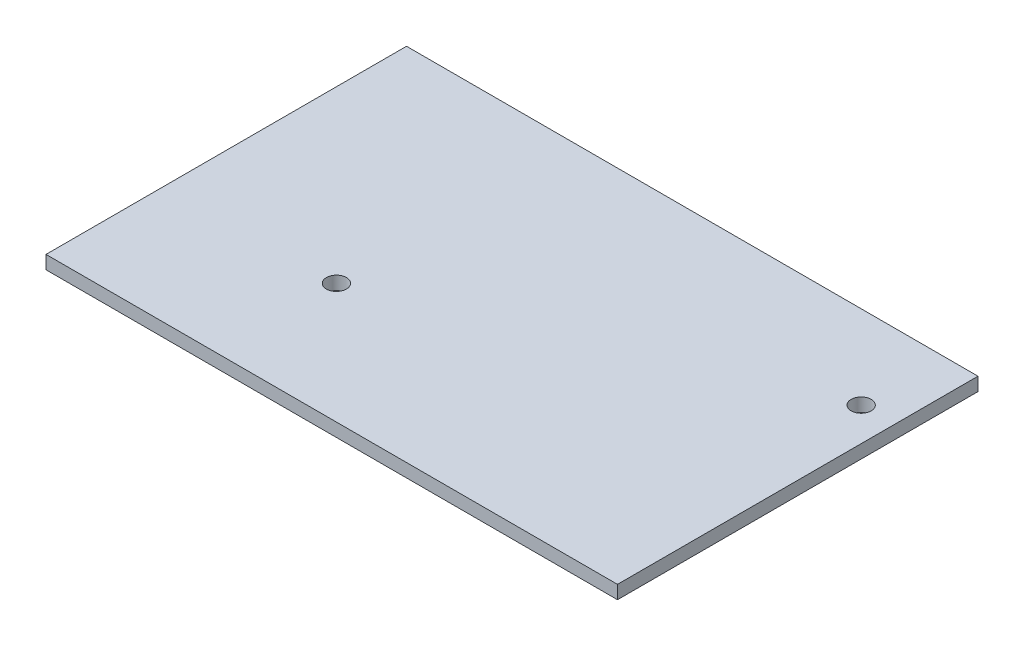
ISO-10303-21;
HEADER;
FILE_DESCRIPTION(('STEP AP214'),'2;1');
FILE_NAME('part.step','',(''),(''),'','','');
FILE_SCHEMA(('AUTOMOTIVE_DESIGN { 1 0 10303 214 1 1 1 1 }'));
ENDSEC;
DATA;
#1=APPLICATION_CONTEXT('core data for automotive mechanical design processes');
#2=APPLICATION_PROTOCOL_DEFINITION('international standard','automotive_design',2000,#1);
#3=PRODUCT_CONTEXT('',#1,'mechanical');
#4=PRODUCT('Part','Part','',(#3));
#5=PRODUCT_RELATED_PRODUCT_CATEGORY('part','',(#4));
#6=PRODUCT_DEFINITION_FORMATION('','',#4);
#7=PRODUCT_DEFINITION_CONTEXT('part definition',#1,'design');
#8=PRODUCT_DEFINITION('design','',#6,#7);
#9=PRODUCT_DEFINITION_SHAPE('','',#8);
#10=(LENGTH_UNIT() NAMED_UNIT(*) SI_UNIT(.MILLI.,.METRE.));
#11=(NAMED_UNIT(*) PLANE_ANGLE_UNIT() SI_UNIT($,.RADIAN.));
#12=(NAMED_UNIT(*) SI_UNIT($,.STERADIAN.) SOLID_ANGLE_UNIT());
#13=UNCERTAINTY_MEASURE_WITH_UNIT(LENGTH_MEASURE(1.E-05),#10,'distance_accuracy_value','');
#14=(GEOMETRIC_REPRESENTATION_CONTEXT(3) GLOBAL_UNCERTAINTY_ASSIGNED_CONTEXT((#13)) GLOBAL_UNIT_ASSIGNED_CONTEXT((#10,
#11,#12)) REPRESENTATION_CONTEXT('',''));
#15=CARTESIAN_POINT('',(0.,0.,0.));
#16=DIRECTION('',(0.,0.,1.));
#17=DIRECTION('',(1.,0.,0.));
#18=AXIS2_PLACEMENT_3D('',#15,#16,#17);
#19=CARTESIAN_POINT('',(0.,2.,0.));
#20=DIRECTION('',(0.,1.,0.));
#21=DIRECTION('',(0.,0.,1.));
#22=AXIS2_PLACEMENT_3D('',#19,#20,#21);
#23=PLANE('',#22);
#24=CARTESIAN_POINT('',(-110.688679245283,2.,-25.6415094339623));
#25=DIRECTION('',(0.,1.,0.));
#26=DIRECTION('',(0.,0.,1.));
#27=AXIS2_PLACEMENT_3D('',#24,#25,#26);
#28=CIRCLE('',#27,1.5);
#29=CARTESIAN_POINT('',(-110.688679245283,2.,-24.1415094339623));
#30=VERTEX_POINT('',#29);
#31=EDGE_CURVE('E112',#30,#30,#28,.T.);
#32=ORIENTED_EDGE('',*,*,#31,.F.);
#33=EDGE_LOOP('',(#32));
#34=FACE_BOUND('',#33,.T.);
#35=DIRECTION('',(0.,0.,1.));
#36=VECTOR('',#35,1.);
#37=CARTESIAN_POINT('',(-136.188679245283,2.,-61.6415094339623));
#38=LINE('',#37,#36);
#39=CARTESIAN_POINT('',(-136.188679245283,2.,-61.6415094339623));
#40=VERTEX_POINT('',#39);
#41=CARTESIAN_POINT('',(-136.188679245283,2.,-7.64150943396226));
#42=VERTEX_POINT('',#41);
#43=EDGE_CURVE('E92',#40,#42,#38,.T.);
#44=ORIENTED_EDGE('',*,*,#43,.T.);
#45=DIRECTION('',(1.,0.,0.));
#46=VECTOR('',#45,1.);
#47=CARTESIAN_POINT('',(-136.188679245283,2.,-7.64150943396226));
#48=LINE('',#47,#46);
#49=CARTESIAN_POINT('',(-50.588679245283,2.,-7.64150943396227));
#50=VERTEX_POINT('',#49);
#51=EDGE_CURVE('E87',#42,#50,#48,.T.);
#52=ORIENTED_EDGE('',*,*,#51,.T.);
#53=DIRECTION('',(0.,0.,-1.));
#54=VECTOR('',#53,1.);
#55=CARTESIAN_POINT('',(-50.588679245283,2.,-61.6415094339623));
#56=LINE('',#55,#54);
#57=CARTESIAN_POINT('',(-50.588679245283,2.,-61.6415094339623));
#58=VERTEX_POINT('',#57);
#59=EDGE_CURVE('E90',#50,#58,#56,.T.);
#60=ORIENTED_EDGE('',*,*,#59,.T.);
#61=DIRECTION('',(-1.,0.,0.));
#62=VECTOR('',#61,1.);
#63=CARTESIAN_POINT('',(-136.188679245283,2.,-61.6415094339623));
#64=LINE('',#63,#62);
#65=EDGE_CURVE('E57',#58,#40,#64,.T.);
#66=ORIENTED_EDGE('',*,*,#65,.T.);
#67=EDGE_LOOP('',(#44,#52,#60,#66));
#68=FACE_BOUND('',#67,.T.);
#69=CARTESIAN_POINT('',(-55.588679245283,2.,-49.1415094339623));
#70=DIRECTION('',(0.,1.,0.));
#71=DIRECTION('',(0.,0.,1.));
#72=AXIS2_PLACEMENT_3D('',#69,#70,#71);
#73=CIRCLE('',#72,1.5);
#74=CARTESIAN_POINT('',(-55.588679245283,2.,-47.6415094339623));
#75=VERTEX_POINT('',#74);
#76=EDGE_CURVE('E134',#75,#75,#73,.T.);
#77=ORIENTED_EDGE('',*,*,#76,.F.);
#78=EDGE_LOOP('',(#77));
#79=FACE_BOUND('',#78,.T.);
#80=ADVANCED_FACE('F39',(#34,#68,#79),#23,.T.);
#81=CARTESIAN_POINT('',(0.,0.,0.));
#82=DIRECTION('',(0.,1.,0.));
#83=DIRECTION('',(0.,0.,1.));
#84=AXIS2_PLACEMENT_3D('',#81,#82,#83);
#85=PLANE('',#84);
#86=DIRECTION('',(0.,0.,1.));
#87=VECTOR('',#86,1.);
#88=CARTESIAN_POINT('',(-136.188679245283,0.,-61.6415094339623));
#89=LINE('',#88,#87);
#90=CARTESIAN_POINT('',(-136.188679245283,0.,-61.6415094339623));
#91=VERTEX_POINT('',#90);
#92=CARTESIAN_POINT('',(-136.188679245283,0.,-7.64150943396226));
#93=VERTEX_POINT('',#92);
#94=EDGE_CURVE('E108',#91,#93,#89,.T.);
#95=ORIENTED_EDGE('',*,*,#94,.F.);
#96=DIRECTION('',(-1.,0.,0.));
#97=VECTOR('',#96,1.);
#98=CARTESIAN_POINT('',(-136.188679245283,0.,-61.6415094339623));
#99=LINE('',#98,#97);
#100=CARTESIAN_POINT('',(-50.588679245283,0.,-61.6415094339623));
#101=VERTEX_POINT('',#100);
#102=EDGE_CURVE('E80',#101,#91,#99,.T.);
#103=ORIENTED_EDGE('',*,*,#102,.F.);
#104=DIRECTION('',(0.,0.,-1.));
#105=VECTOR('',#104,1.);
#106=CARTESIAN_POINT('',(-50.588679245283,0.,-61.6415094339623));
#107=LINE('',#106,#105);
#108=CARTESIAN_POINT('',(-50.588679245283,0.,-7.64150943396227));
#109=VERTEX_POINT('',#108);
#110=EDGE_CURVE('E74',#109,#101,#107,.T.);
#111=ORIENTED_EDGE('',*,*,#110,.F.);
#112=DIRECTION('',(1.,0.,0.));
#113=VECTOR('',#112,1.);
#114=CARTESIAN_POINT('',(-136.188679245283,0.,-7.64150943396226));
#115=LINE('',#114,#113);
#116=EDGE_CURVE('E97',#93,#109,#115,.T.);
#117=ORIENTED_EDGE('',*,*,#116,.F.);
#118=EDGE_LOOP('',(#95,#103,#111,#117));
#119=FACE_BOUND('',#118,.T.);
#120=CARTESIAN_POINT('',(-110.688679245283,0.,-25.6415094339623));
#121=DIRECTION('',(0.,1.,0.));
#122=DIRECTION('',(0.,0.,1.));
#123=AXIS2_PLACEMENT_3D('',#120,#121,#122);
#124=CIRCLE('',#123,1.5);
#125=CARTESIAN_POINT('',(-110.688679245283,0.,-24.1415094339623));
#126=VERTEX_POINT('',#125);
#127=EDGE_CURVE('E130',#126,#126,#124,.T.);
#128=ORIENTED_EDGE('',*,*,#127,.T.);
#129=EDGE_LOOP('',(#128));
#130=FACE_BOUND('',#129,.T.);
#131=CARTESIAN_POINT('',(-55.588679245283,0.,-49.1415094339623));
#132=DIRECTION('',(0.,1.,0.));
#133=DIRECTION('',(0.,0.,1.));
#134=AXIS2_PLACEMENT_3D('',#131,#132,#133);
#135=CIRCLE('',#134,1.5);
#136=CARTESIAN_POINT('',(-55.588679245283,0.,-47.6415094339623));
#137=VERTEX_POINT('',#136);
#138=EDGE_CURVE('E138',#137,#137,#135,.T.);
#139=ORIENTED_EDGE('',*,*,#138,.T.);
#140=EDGE_LOOP('',(#139));
#141=FACE_BOUND('',#140,.T.);
#142=ADVANCED_FACE('F125',(#119,#130,#141),#85,.F.);
#143=CARTESIAN_POINT('',(-136.188679245283,2.,-61.6415094339623));
#144=DIRECTION('',(1.,0.,0.));
#145=DIRECTION('',(0.,0.,-1.));
#146=AXIS2_PLACEMENT_3D('',#143,#144,#145);
#147=PLANE('',#146);
#148=ORIENTED_EDGE('',*,*,#94,.T.);
#149=DIRECTION('',(0.,-1.,0.));
#150=VECTOR('',#149,1.);
#151=CARTESIAN_POINT('',(-136.188679245283,2.,-7.64150943396226));
#152=LINE('',#151,#150);
#153=EDGE_CURVE('E11',#42,#93,#152,.T.);
#154=ORIENTED_EDGE('',*,*,#153,.F.);
#155=ORIENTED_EDGE('',*,*,#43,.F.);
#156=DIRECTION('',(0.,-1.,0.));
#157=VECTOR('',#156,1.);
#158=CARTESIAN_POINT('',(-136.188679245283,2.,-61.6415094339623));
#159=LINE('',#158,#157);
#160=EDGE_CURVE('E104',#40,#91,#159,.T.);
#161=ORIENTED_EDGE('',*,*,#160,.T.);
#162=EDGE_LOOP('',(#148,#154,#155,#161));
#163=FACE_BOUND('',#162,.T.);
#164=ADVANCED_FACE('F41',(#163),#147,.F.);
#165=CARTESIAN_POINT('',(-136.188679245283,2.,-7.64150943396226));
#166=DIRECTION('',(0.,0.,-1.));
#167=DIRECTION('',(-1.,0.,0.));
#168=AXIS2_PLACEMENT_3D('',#165,#166,#167);
#169=PLANE('',#168);
#170=ORIENTED_EDGE('',*,*,#116,.T.);
#171=DIRECTION('',(0.,-1.,0.));
#172=VECTOR('',#171,1.);
#173=CARTESIAN_POINT('',(-50.588679245283,2.,-7.64150943396227));
#174=LINE('',#173,#172);
#175=EDGE_CURVE('E49',#50,#109,#174,.T.);
#176=ORIENTED_EDGE('',*,*,#175,.F.);
#177=ORIENTED_EDGE('',*,*,#51,.F.);
#178=ORIENTED_EDGE('',*,*,#153,.T.);
#179=EDGE_LOOP('',(#170,#176,#177,#178));
#180=FACE_BOUND('',#179,.T.);
#181=ADVANCED_FACE('F96',(#180),#169,.F.);
#182=CARTESIAN_POINT('',(-50.588679245283,2.,-61.6415094339623));
#183=DIRECTION('',(-1.,0.,0.));
#184=DIRECTION('',(0.,0.,1.));
#185=AXIS2_PLACEMENT_3D('',#182,#183,#184);
#186=PLANE('',#185);
#187=ORIENTED_EDGE('',*,*,#110,.T.);
#188=DIRECTION('',(0.,-1.,0.));
#189=VECTOR('',#188,1.);
#190=CARTESIAN_POINT('',(-50.588679245283,2.,-61.6415094339623));
#191=LINE('',#190,#189);
#192=EDGE_CURVE('E99',#58,#101,#191,.T.);
#193=ORIENTED_EDGE('',*,*,#192,.F.);
#194=ORIENTED_EDGE('',*,*,#59,.F.);
#195=ORIENTED_EDGE('',*,*,#175,.T.);
#196=EDGE_LOOP('',(#187,#193,#194,#195));
#197=FACE_BOUND('',#196,.T.);
#198=ADVANCED_FACE('F100',(#197),#186,.F.);
#199=CARTESIAN_POINT('',(-136.188679245283,2.,-61.6415094339623));
#200=DIRECTION('',(0.,0.,1.));
#201=DIRECTION('',(1.,0.,0.));
#202=AXIS2_PLACEMENT_3D('',#199,#200,#201);
#203=PLANE('',#202);
#204=ORIENTED_EDGE('',*,*,#102,.T.);
#205=ORIENTED_EDGE('',*,*,#160,.F.);
#206=ORIENTED_EDGE('',*,*,#65,.F.);
#207=ORIENTED_EDGE('',*,*,#192,.T.);
#208=EDGE_LOOP('',(#204,#205,#206,#207));
#209=FACE_BOUND('',#208,.T.);
#210=ADVANCED_FACE('F122',(#209),#203,.F.);
#211=CARTESIAN_POINT('',(-110.688679245283,2.,-25.6415094339623));
#212=DIRECTION('',(0.,-1.,0.));
#213=DIRECTION('',(0.,0.,-1.));
#214=AXIS2_PLACEMENT_3D('',#211,#212,#213);
#215=CYLINDRICAL_SURFACE('',#214,1.5);
#216=ORIENTED_EDGE('',*,*,#31,.T.);
#217=EDGE_LOOP('',(#216));
#218=FACE_BOUND('',#217,.T.);
#219=ORIENTED_EDGE('',*,*,#127,.F.);
#220=EDGE_LOOP('',(#219));
#221=FACE_BOUND('',#220,.T.);
#222=ADVANCED_FACE('F157',(#218,#221),#215,.F.);
#223=CARTESIAN_POINT('',(-55.588679245283,2.,-49.1415094339623));
#224=DIRECTION('',(0.,-1.,0.));
#225=DIRECTION('',(0.,0.,-1.));
#226=AXIS2_PLACEMENT_3D('',#223,#224,#225);
#227=CYLINDRICAL_SURFACE('',#226,1.5);
#228=ORIENTED_EDGE('',*,*,#76,.T.);
#229=EDGE_LOOP('',(#228));
#230=FACE_BOUND('',#229,.T.);
#231=ORIENTED_EDGE('',*,*,#138,.F.);
#232=EDGE_LOOP('',(#231));
#233=FACE_BOUND('',#232,.T.);
#234=ADVANCED_FACE('F146',(#230,#233),#227,.F.);
#235=CLOSED_SHELL('',(#80,#142,#164,#181,#198,#210,#222,#234));
#236=MANIFOLD_SOLID_BREP('B2',#235);
#237=ADVANCED_BREP_SHAPE_REPRESENTATION('',(#18,#236),#14);
#238=SHAPE_DEFINITION_REPRESENTATION(#9,#237);
ENDSEC;
END-ISO-10303-21;
